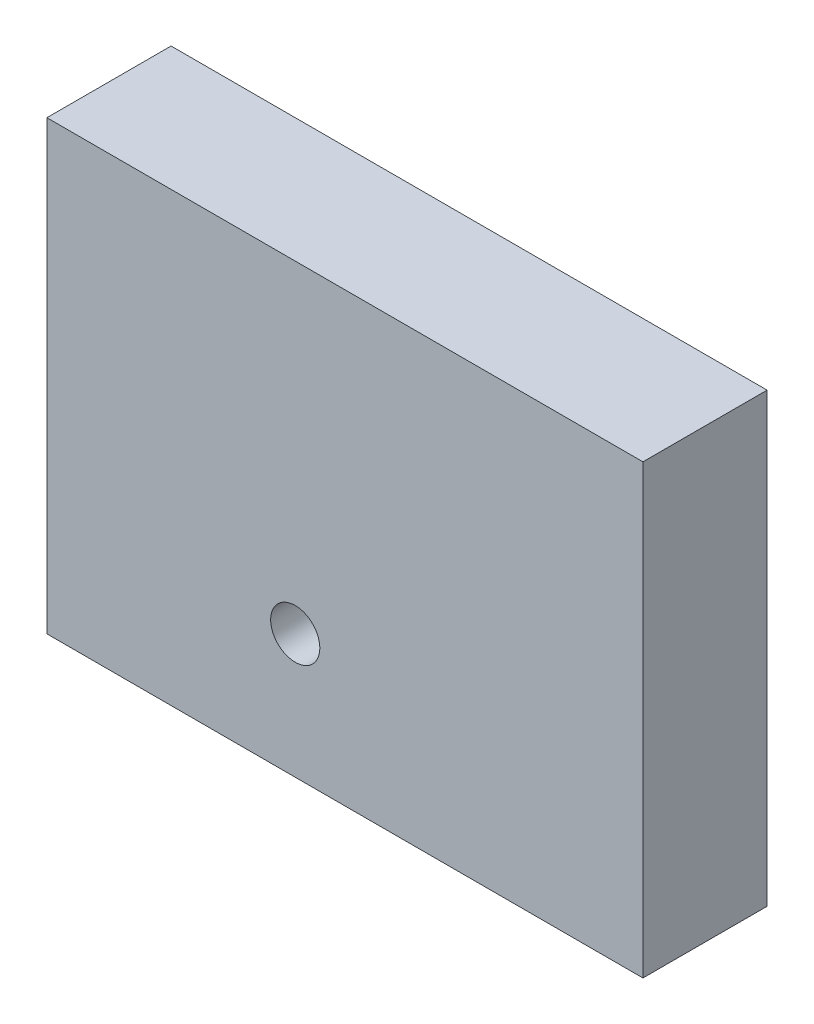
ISO-10303-21;
HEADER;
FILE_DESCRIPTION(('STEP AP214'),'2;1');
FILE_NAME('part.step','',(''),(''),'','','');
FILE_SCHEMA(('AUTOMOTIVE_DESIGN { 1 0 10303 214 1 1 1 1 }'));
ENDSEC;
DATA;
#1=APPLICATION_CONTEXT('core data for automotive mechanical design processes');
#2=APPLICATION_PROTOCOL_DEFINITION('international standard','automotive_design',2000,#1);
#3=PRODUCT_CONTEXT('',#1,'mechanical');
#4=PRODUCT('Part','Part','',(#3));
#5=PRODUCT_RELATED_PRODUCT_CATEGORY('part','',(#4));
#6=PRODUCT_DEFINITION_FORMATION('','',#4);
#7=PRODUCT_DEFINITION_CONTEXT('part definition',#1,'design');
#8=PRODUCT_DEFINITION('design','',#6,#7);
#9=PRODUCT_DEFINITION_SHAPE('','',#8);
#10=(LENGTH_UNIT() NAMED_UNIT(*) SI_UNIT(.MILLI.,.METRE.));
#11=(NAMED_UNIT(*) PLANE_ANGLE_UNIT() SI_UNIT($,.RADIAN.));
#12=(NAMED_UNIT(*) SI_UNIT($,.STERADIAN.) SOLID_ANGLE_UNIT());
#13=UNCERTAINTY_MEASURE_WITH_UNIT(LENGTH_MEASURE(1.E-05),#10,'distance_accuracy_value','');
#14=(GEOMETRIC_REPRESENTATION_CONTEXT(3) GLOBAL_UNCERTAINTY_ASSIGNED_CONTEXT((#13)) GLOBAL_UNIT_ASSIGNED_CONTEXT((#10,
#11,#12)) REPRESENTATION_CONTEXT('',''));
#15=CARTESIAN_POINT('',(0.,0.,0.));
#16=DIRECTION('',(0.,0.,1.));
#17=DIRECTION('',(1.,0.,0.));
#18=AXIS2_PLACEMENT_3D('',#15,#16,#17);
#19=CARTESIAN_POINT('',(0.,0.,10.));
#20=DIRECTION('',(0.,0.,-1.));
#21=DIRECTION('',(-1.,0.,0.));
#22=AXIS2_PLACEMENT_3D('',#19,#20,#21);
#23=PLANE('',#22);
#24=DIRECTION('',(0.,1.,0.));
#25=VECTOR('',#24,1.);
#26=CARTESIAN_POINT('',(24.,-18.,10.));
#27=LINE('',#26,#25);
#28=CARTESIAN_POINT('',(24.,-18.,10.));
#29=VERTEX_POINT('',#28);
#30=CARTESIAN_POINT('',(24.,18.,10.));
#31=VERTEX_POINT('',#30);
#32=EDGE_CURVE('E85',#29,#31,#27,.T.);
#33=ORIENTED_EDGE('',*,*,#32,.T.);
#34=DIRECTION('',(-1.,0.,0.));
#35=VECTOR('',#34,1.);
#36=CARTESIAN_POINT('',(-24.,18.,10.));
#37=LINE('',#36,#35);
#38=CARTESIAN_POINT('',(-24.,18.,10.));
#39=VERTEX_POINT('',#38);
#40=EDGE_CURVE('E80',#31,#39,#37,.T.);
#41=ORIENTED_EDGE('',*,*,#40,.T.);
#42=DIRECTION('',(0.,-1.,0.));
#43=VECTOR('',#42,1.);
#44=CARTESIAN_POINT('',(-24.,-18.,10.));
#45=LINE('',#44,#43);
#46=CARTESIAN_POINT('',(-24.,-18.,10.));
#47=VERTEX_POINT('',#46);
#48=EDGE_CURVE('E83',#39,#47,#45,.T.);
#49=ORIENTED_EDGE('',*,*,#48,.T.);
#50=DIRECTION('',(1.,0.,0.));
#51=VECTOR('',#50,1.);
#52=CARTESIAN_POINT('',(-24.,-18.,10.));
#53=LINE('',#52,#51);
#54=EDGE_CURVE('E50',#47,#29,#53,.T.);
#55=ORIENTED_EDGE('',*,*,#54,.T.);
#56=EDGE_LOOP('',(#33,#41,#49,#55));
#57=FACE_BOUND('',#56,.T.);
#58=CARTESIAN_POINT('',(-4.,-8.,10.));
#59=DIRECTION('',(0.,0.,1.));
#60=DIRECTION('',(1.,0.,0.));
#61=AXIS2_PLACEMENT_3D('',#58,#59,#60);
#62=CIRCLE('',#61,1.97989898732233);
#63=CARTESIAN_POINT('',(-2.02010101267767,-8.,10.));
#64=VERTEX_POINT('',#63);
#65=EDGE_CURVE('E111',#64,#64,#62,.T.);
#66=ORIENTED_EDGE('',*,*,#65,.F.);
#67=EDGE_LOOP('',(#66));
#68=FACE_BOUND('',#67,.T.);
#69=ADVANCED_FACE('F33',(#57,#68),#23,.F.);
#70=CARTESIAN_POINT('',(0.,0.,0.));
#71=DIRECTION('',(0.,0.,-1.));
#72=DIRECTION('',(-1.,0.,0.));
#73=AXIS2_PLACEMENT_3D('',#70,#71,#72);
#74=PLANE('',#73);
#75=CARTESIAN_POINT('',(-4.,-8.,0.));
#76=DIRECTION('',(0.,0.,1.));
#77=DIRECTION('',(1.,0.,0.));
#78=AXIS2_PLACEMENT_3D('',#75,#76,#77);
#79=CIRCLE('',#78,1.97989898732233);
#80=CARTESIAN_POINT('',(-2.02010101267767,-8.,0.));
#81=VERTEX_POINT('',#80);
#82=EDGE_CURVE('E100',#81,#81,#79,.T.);
#83=ORIENTED_EDGE('',*,*,#82,.T.);
#84=EDGE_LOOP('',(#83));
#85=FACE_BOUND('',#84,.T.);
#86=DIRECTION('',(0.,1.,0.));
#87=VECTOR('',#86,1.);
#88=CARTESIAN_POINT('',(24.,-18.,0.));
#89=LINE('',#88,#87);
#90=CARTESIAN_POINT('',(24.,-18.,0.));
#91=VERTEX_POINT('',#90);
#92=CARTESIAN_POINT('',(24.,18.,0.));
#93=VERTEX_POINT('',#92);
#94=EDGE_CURVE('E97',#91,#93,#89,.T.);
#95=ORIENTED_EDGE('',*,*,#94,.F.);
#96=DIRECTION('',(1.,0.,0.));
#97=VECTOR('',#96,1.);
#98=CARTESIAN_POINT('',(-24.,-18.,0.));
#99=LINE('',#98,#97);
#100=CARTESIAN_POINT('',(-24.,-18.,0.));
#101=VERTEX_POINT('',#100);
#102=EDGE_CURVE('E73',#101,#91,#99,.T.);
#103=ORIENTED_EDGE('',*,*,#102,.F.);
#104=DIRECTION('',(0.,-1.,0.));
#105=VECTOR('',#104,1.);
#106=CARTESIAN_POINT('',(-24.,-18.,0.));
#107=LINE('',#106,#105);
#108=CARTESIAN_POINT('',(-24.,18.,0.));
#109=VERTEX_POINT('',#108);
#110=EDGE_CURVE('E67',#109,#101,#107,.T.);
#111=ORIENTED_EDGE('',*,*,#110,.F.);
#112=DIRECTION('',(-1.,0.,0.));
#113=VECTOR('',#112,1.);
#114=CARTESIAN_POINT('',(-24.,18.,0.));
#115=LINE('',#114,#113);
#116=EDGE_CURVE('E89',#93,#109,#115,.T.);
#117=ORIENTED_EDGE('',*,*,#116,.F.);
#118=EDGE_LOOP('',(#95,#103,#111,#117));
#119=FACE_BOUND('',#118,.T.);
#120=ADVANCED_FACE('F108',(#85,#119),#74,.T.);
#121=CARTESIAN_POINT('',(24.,-18.,10.));
#122=DIRECTION('',(-1.,0.,0.));
#123=DIRECTION('',(0.,0.,1.));
#124=AXIS2_PLACEMENT_3D('',#121,#122,#123);
#125=PLANE('',#124);
#126=ORIENTED_EDGE('',*,*,#94,.T.);
#127=DIRECTION('',(0.,0.,-1.));
#128=VECTOR('',#127,1.);
#129=CARTESIAN_POINT('',(24.,18.,10.));
#130=LINE('',#129,#128);
#131=EDGE_CURVE('E11',#31,#93,#130,.T.);
#132=ORIENTED_EDGE('',*,*,#131,.F.);
#133=ORIENTED_EDGE('',*,*,#32,.F.);
#134=DIRECTION('',(0.,0.,-1.));
#135=VECTOR('',#134,1.);
#136=CARTESIAN_POINT('',(24.,-18.,10.));
#137=LINE('',#136,#135);
#138=EDGE_CURVE('E93',#29,#91,#137,.T.);
#139=ORIENTED_EDGE('',*,*,#138,.T.);
#140=EDGE_LOOP('',(#126,#132,#133,#139));
#141=FACE_BOUND('',#140,.T.);
#142=ADVANCED_FACE('F35',(#141),#125,.F.);
#143=CARTESIAN_POINT('',(-24.,18.,10.));
#144=DIRECTION('',(0.,-1.,0.));
#145=DIRECTION('',(0.,0.,-1.));
#146=AXIS2_PLACEMENT_3D('',#143,#144,#145);
#147=PLANE('',#146);
#148=ORIENTED_EDGE('',*,*,#116,.T.);
#149=DIRECTION('',(0.,0.,-1.));
#150=VECTOR('',#149,1.);
#151=CARTESIAN_POINT('',(-24.,18.,10.));
#152=LINE('',#151,#150);
#153=EDGE_CURVE('E42',#39,#109,#152,.T.);
#154=ORIENTED_EDGE('',*,*,#153,.F.);
#155=ORIENTED_EDGE('',*,*,#40,.F.);
#156=ORIENTED_EDGE('',*,*,#131,.T.);
#157=EDGE_LOOP('',(#148,#154,#155,#156));
#158=FACE_BOUND('',#157,.T.);
#159=ADVANCED_FACE('F88',(#158),#147,.F.);
#160=CARTESIAN_POINT('',(-24.,-18.,10.));
#161=DIRECTION('',(1.,0.,0.));
#162=DIRECTION('',(0.,0.,-1.));
#163=AXIS2_PLACEMENT_3D('',#160,#161,#162);
#164=PLANE('',#163);
#165=ORIENTED_EDGE('',*,*,#110,.T.);
#166=DIRECTION('',(0.,0.,-1.));
#167=VECTOR('',#166,1.);
#168=CARTESIAN_POINT('',(-24.,-18.,10.));
#169=LINE('',#168,#167);
#170=EDGE_CURVE('E90',#47,#101,#169,.T.);
#171=ORIENTED_EDGE('',*,*,#170,.F.);
#172=ORIENTED_EDGE('',*,*,#48,.F.);
#173=ORIENTED_EDGE('',*,*,#153,.T.);
#174=EDGE_LOOP('',(#165,#171,#172,#173));
#175=FACE_BOUND('',#174,.T.);
#176=ADVANCED_FACE('F91',(#175),#164,.F.);
#177=CARTESIAN_POINT('',(-24.,-18.,10.));
#178=DIRECTION('',(0.,1.,0.));
#179=DIRECTION('',(0.,0.,1.));
#180=AXIS2_PLACEMENT_3D('',#177,#178,#179);
#181=PLANE('',#180);
#182=ORIENTED_EDGE('',*,*,#102,.T.);
#183=ORIENTED_EDGE('',*,*,#138,.F.);
#184=ORIENTED_EDGE('',*,*,#54,.F.);
#185=ORIENTED_EDGE('',*,*,#170,.T.);
#186=EDGE_LOOP('',(#182,#183,#184,#185));
#187=FACE_BOUND('',#186,.T.);
#188=ADVANCED_FACE('F105',(#187),#181,.F.);
#189=CARTESIAN_POINT('',(-4.,-8.,0.));
#190=DIRECTION('',(0.,0.,1.));
#191=DIRECTION('',(1.,0.,0.));
#192=AXIS2_PLACEMENT_3D('',#189,#190,#191);
#193=CYLINDRICAL_SURFACE('',#192,1.97989898732233);
#194=ORIENTED_EDGE('',*,*,#65,.T.);
#195=EDGE_LOOP('',(#194));
#196=FACE_BOUND('',#195,.T.);
#197=ORIENTED_EDGE('',*,*,#82,.F.);
#198=EDGE_LOOP('',(#197));
#199=FACE_BOUND('',#198,.T.);
#200=ADVANCED_FACE('F118',(#196,#199),#193,.F.);
#201=CLOSED_SHELL('',(#69,#120,#142,#159,#176,#188,#200));
#202=MANIFOLD_SOLID_BREP('B2',#201);
#203=ADVANCED_BREP_SHAPE_REPRESENTATION('',(#18,#202),#14);
#204=SHAPE_DEFINITION_REPRESENTATION(#9,#203);
ENDSEC;
END-ISO-10303-21;
